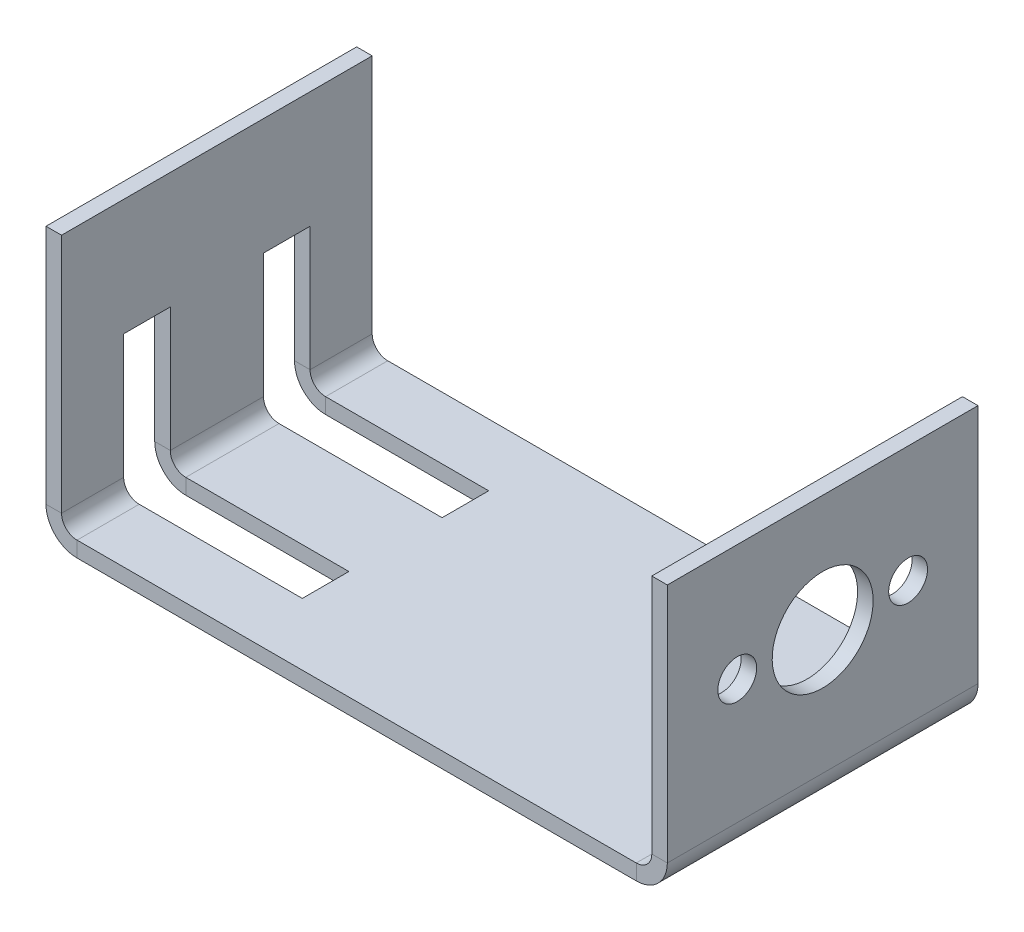
ISO-10303-21;
HEADER;
FILE_DESCRIPTION(('STEP AP214'),'2;1');
FILE_NAME('part.step','',(''),(''),'','','');
FILE_SCHEMA(('AUTOMOTIVE_DESIGN { 1 0 10303 214 1 1 1 1 }'));
ENDSEC;
DATA;
#1=APPLICATION_CONTEXT('core data for automotive mechanical design processes');
#2=APPLICATION_PROTOCOL_DEFINITION('international standard','automotive_design',2000,#1);
#3=PRODUCT_CONTEXT('',#1,'mechanical');
#4=PRODUCT('Part','Part','',(#3));
#5=PRODUCT_RELATED_PRODUCT_CATEGORY('part','',(#4));
#6=PRODUCT_DEFINITION_FORMATION('','',#4);
#7=PRODUCT_DEFINITION_CONTEXT('part definition',#1,'design');
#8=PRODUCT_DEFINITION('design','',#6,#7);
#9=PRODUCT_DEFINITION_SHAPE('','',#8);
#10=(LENGTH_UNIT() NAMED_UNIT(*) SI_UNIT(.MILLI.,.METRE.));
#11=(NAMED_UNIT(*) PLANE_ANGLE_UNIT() SI_UNIT($,.RADIAN.));
#12=(NAMED_UNIT(*) SI_UNIT($,.STERADIAN.) SOLID_ANGLE_UNIT());
#13=UNCERTAINTY_MEASURE_WITH_UNIT(LENGTH_MEASURE(1.E-05),#10,'distance_accuracy_value','');
#14=(GEOMETRIC_REPRESENTATION_CONTEXT(3) GLOBAL_UNCERTAINTY_ASSIGNED_CONTEXT((#13)) GLOBAL_UNIT_ASSIGNED_CONTEXT((#10,
#11,#12)) REPRESENTATION_CONTEXT('',''));
#15=CARTESIAN_POINT('',(0.,0.,0.));
#16=DIRECTION('',(0.,0.,1.));
#17=DIRECTION('',(1.,0.,0.));
#18=AXIS2_PLACEMENT_3D('',#15,#16,#17);
#19=CARTESIAN_POINT('',(-15.,20.0000000000001,12.));
#20=DIRECTION('',(0.,0.,1.));
#21=DIRECTION('',(0.,-1.,0.));
#22=AXIS2_PLACEMENT_3D('',#19,#20,#21);
#23=PLANE('',#22);
#24=DIRECTION('',(0.,-1.,0.));
#25=VECTOR('',#24,1.);
#26=CARTESIAN_POINT('',(-38.,-1.41530656011703E-13,12.));
#27=LINE('',#26,#25);
#28=CARTESIAN_POINT('',(-38.,20.0000000000001,12.));
#29=VERTEX_POINT('',#28);
#30=CARTESIAN_POINT('',(-38.,4.,12.));
#31=VERTEX_POINT('',#30);
#32=EDGE_CURVE('E601',#29,#31,#27,.T.);
#33=ORIENTED_EDGE('',*,*,#32,.T.);
#34=DIRECTION('',(-1.,0.,0.));
#35=VECTOR('',#34,1.);
#36=CARTESIAN_POINT('',(-38.,4.,12.));
#37=LINE('',#36,#35);
#38=CARTESIAN_POINT('',(-40.,3.99999999999999,12.));
#39=VERTEX_POINT('',#38);
#40=EDGE_CURVE('E13',#31,#39,#37,.T.);
#41=ORIENTED_EDGE('',*,*,#40,.T.);
#42=DIRECTION('',(0.,1.,0.));
#43=VECTOR('',#42,1.);
#44=CARTESIAN_POINT('',(-40.,20.,12.));
#45=LINE('',#44,#43);
#46=CARTESIAN_POINT('',(-40.,20.,12.));
#47=VERTEX_POINT('',#46);
#48=EDGE_CURVE('E282',#39,#47,#45,.T.);
#49=ORIENTED_EDGE('',*,*,#48,.T.);
#50=DIRECTION('',(-1.,0.,0.));
#51=VECTOR('',#50,1.);
#52=CARTESIAN_POINT('',(-15.,20.0000000000001,12.));
#53=LINE('',#52,#51);
#54=EDGE_CURVE('E267',#29,#47,#53,.T.);
#55=ORIENTED_EDGE('',*,*,#54,.F.);
#56=EDGE_LOOP('',(#33,#41,#49,#55));
#57=FACE_BOUND('',#56,.T.);
#58=ADVANCED_FACE('F84',(#57),#23,.F.);
#59=DIRECTION('',(1.,0.,0.));
#60=VECTOR('',#59,1.);
#61=CARTESIAN_POINT('',(0.,0.,12.));
#62=LINE('',#61,#60);
#63=CARTESIAN_POINT('',(-36.,0.,12.));
#64=VERTEX_POINT('',#63);
#65=CARTESIAN_POINT('',(-15.,0.,12.));
#66=VERTEX_POINT('',#65);
#67=EDGE_CURVE('E367',#64,#66,#62,.T.);
#68=ORIENTED_EDGE('',*,*,#67,.F.);
#69=DIRECTION('',(0.,1.,0.));
#70=VECTOR('',#69,1.);
#71=CARTESIAN_POINT('',(-36.,0.,12.));
#72=LINE('',#71,#70);
#73=CARTESIAN_POINT('',(-36.,2.,12.));
#74=VERTEX_POINT('',#73);
#75=EDGE_CURVE('E91',#64,#74,#72,.T.);
#76=ORIENTED_EDGE('',*,*,#75,.T.);
#77=DIRECTION('',(1.,0.,0.));
#78=VECTOR('',#77,1.);
#79=CARTESIAN_POINT('',(0.,2.,12.));
#80=LINE('',#79,#78);
#81=CARTESIAN_POINT('',(-15.,2.,12.));
#82=VERTEX_POINT('',#81);
#83=EDGE_CURVE('E361',#74,#82,#80,.T.);
#84=ORIENTED_EDGE('',*,*,#83,.T.);
#85=DIRECTION('',(0.,1.,0.));
#86=VECTOR('',#85,1.);
#87=CARTESIAN_POINT('',(-15.,20.0000000000001,12.));
#88=LINE('',#87,#86);
#89=EDGE_CURVE('E281',#66,#82,#88,.T.);
#90=ORIENTED_EDGE('',*,*,#89,.F.);
#91=EDGE_LOOP('',(#68,#76,#84,#90));
#92=FACE_BOUND('',#91,.T.);
#93=ADVANCED_FACE('F639',(#92),#23,.F.);
#94=CARTESIAN_POINT('',(-15.,20.0000000000001,6.));
#95=DIRECTION('',(0.,0.,-1.));
#96=DIRECTION('',(0.,1.,0.));
#97=AXIS2_PLACEMENT_3D('',#94,#95,#96);
#98=PLANE('',#97);
#99=DIRECTION('',(0.,-1.,0.));
#100=VECTOR('',#99,1.);
#101=CARTESIAN_POINT('',(-40.,20.,6.));
#102=LINE('',#101,#100);
#103=CARTESIAN_POINT('',(-40.,20.,6.));
#104=VERTEX_POINT('',#103);
#105=CARTESIAN_POINT('',(-40.,3.99999999999999,6.));
#106=VERTEX_POINT('',#105);
#107=EDGE_CURVE('E287',#104,#106,#102,.T.);
#108=ORIENTED_EDGE('',*,*,#107,.T.);
#109=DIRECTION('',(1.,0.,0.));
#110=VECTOR('',#109,1.);
#111=CARTESIAN_POINT('',(-40.,3.99999999999999,6.));
#112=LINE('',#111,#110);
#113=CARTESIAN_POINT('',(-38.,4.,6.));
#114=VERTEX_POINT('',#113);
#115=EDGE_CURVE('E632',#106,#114,#112,.T.);
#116=ORIENTED_EDGE('',*,*,#115,.T.);
#117=DIRECTION('',(0.,1.,0.));
#118=VECTOR('',#117,1.);
#119=CARTESIAN_POINT('',(-38.,-1.42438538706224E-13,6.));
#120=LINE('',#119,#118);
#121=CARTESIAN_POINT('',(-38.,20.,6.));
#122=VERTEX_POINT('',#121);
#123=EDGE_CURVE('E608',#114,#122,#120,.T.);
#124=ORIENTED_EDGE('',*,*,#123,.T.);
#125=DIRECTION('',(-1.,0.,0.));
#126=VECTOR('',#125,1.);
#127=CARTESIAN_POINT('',(-15.,20.0000000000001,6.));
#128=LINE('',#127,#126);
#129=EDGE_CURVE('E277',#122,#104,#128,.T.);
#130=ORIENTED_EDGE('',*,*,#129,.T.);
#131=EDGE_LOOP('',(#108,#116,#124,#130));
#132=FACE_BOUND('',#131,.T.);
#133=ADVANCED_FACE('F740',(#132),#98,.F.);
#134=DIRECTION('',(-1.,0.,0.));
#135=VECTOR('',#134,1.);
#136=CARTESIAN_POINT('',(0.,2.,6.));
#137=LINE('',#136,#135);
#138=CARTESIAN_POINT('',(-15.,2.,6.));
#139=VERTEX_POINT('',#138);
#140=CARTESIAN_POINT('',(-36.,2.,6.));
#141=VERTEX_POINT('',#140);
#142=EDGE_CURVE('E376',#139,#141,#137,.T.);
#143=ORIENTED_EDGE('',*,*,#142,.T.);
#144=DIRECTION('',(0.,-1.,0.));
#145=VECTOR('',#144,1.);
#146=CARTESIAN_POINT('',(-36.,2.,6.));
#147=LINE('',#146,#145);
#148=CARTESIAN_POINT('',(-36.,0.,6.));
#149=VERTEX_POINT('',#148);
#150=EDGE_CURVE('E629',#141,#149,#147,.T.);
#151=ORIENTED_EDGE('',*,*,#150,.T.);
#152=DIRECTION('',(-1.,0.,0.));
#153=VECTOR('',#152,1.);
#154=CARTESIAN_POINT('',(0.,0.,6.));
#155=LINE('',#154,#153);
#156=CARTESIAN_POINT('',(-15.,0.,6.));
#157=VERTEX_POINT('',#156);
#158=EDGE_CURVE('E388',#157,#149,#155,.T.);
#159=ORIENTED_EDGE('',*,*,#158,.F.);
#160=DIRECTION('',(0.,-1.,0.));
#161=VECTOR('',#160,1.);
#162=CARTESIAN_POINT('',(-15.,20.0000000000001,6.));
#163=LINE('',#162,#161);
#164=EDGE_CURVE('E294',#139,#157,#163,.T.);
#165=ORIENTED_EDGE('',*,*,#164,.F.);
#166=EDGE_LOOP('',(#143,#151,#159,#165));
#167=FACE_BOUND('',#166,.T.);
#168=ADVANCED_FACE('F746',(#167),#98,.F.);
#169=CARTESIAN_POINT('',(-15.,20.0000000000001,-6.));
#170=DIRECTION('',(0.,0.,1.));
#171=DIRECTION('',(0.,-1.,0.));
#172=AXIS2_PLACEMENT_3D('',#169,#170,#171);
#173=PLANE('',#172);
#174=DIRECTION('',(0.,-1.,0.));
#175=VECTOR('',#174,1.);
#176=CARTESIAN_POINT('',(-38.,-1.43709574478553E-13,-6.));
#177=LINE('',#176,#175);
#178=CARTESIAN_POINT('',(-38.,20.0000000000001,-6.));
#179=VERTEX_POINT('',#178);
#180=CARTESIAN_POINT('',(-38.,4.,-6.));
#181=VERTEX_POINT('',#180);
#182=EDGE_CURVE('E579',#179,#181,#177,.T.);
#183=ORIENTED_EDGE('',*,*,#182,.T.);
#184=DIRECTION('',(-1.,0.,0.));
#185=VECTOR('',#184,1.);
#186=CARTESIAN_POINT('',(-38.,4.,-6.));
#187=LINE('',#186,#185);
#188=CARTESIAN_POINT('',(-40.,3.99999999999999,-6.));
#189=VERTEX_POINT('',#188);
#190=EDGE_CURVE('E97',#181,#189,#187,.T.);
#191=ORIENTED_EDGE('',*,*,#190,.T.);
#192=DIRECTION('',(0.,1.,0.));
#193=VECTOR('',#192,1.);
#194=CARTESIAN_POINT('',(-40.,20.,-6.));
#195=LINE('',#194,#193);
#196=CARTESIAN_POINT('',(-40.,20.,-6.));
#197=VERTEX_POINT('',#196);
#198=EDGE_CURVE('E320',#189,#197,#195,.T.);
#199=ORIENTED_EDGE('',*,*,#198,.T.);
#200=DIRECTION('',(-1.,0.,0.));
#201=VECTOR('',#200,1.);
#202=CARTESIAN_POINT('',(-15.,20.0000000000001,-6.));
#203=LINE('',#202,#201);
#204=EDGE_CURVE('E309',#179,#197,#203,.T.);
#205=ORIENTED_EDGE('',*,*,#204,.F.);
#206=EDGE_LOOP('',(#183,#191,#199,#205));
#207=FACE_BOUND('',#206,.T.);
#208=ADVANCED_FACE('F759',(#207),#173,.F.);
#209=DIRECTION('',(1.,0.,0.));
#210=VECTOR('',#209,1.);
#211=CARTESIAN_POINT('',(0.,0.,-6.));
#212=LINE('',#211,#210);
#213=CARTESIAN_POINT('',(-36.,0.,-6.));
#214=VERTEX_POINT('',#213);
#215=CARTESIAN_POINT('',(-15.,0.,-6.));
#216=VERTEX_POINT('',#215);
#217=EDGE_CURVE('E337',#214,#216,#212,.T.);
#218=ORIENTED_EDGE('',*,*,#217,.F.);
#219=DIRECTION('',(0.,1.,0.));
#220=VECTOR('',#219,1.);
#221=CARTESIAN_POINT('',(-36.,0.,-6.));
#222=LINE('',#221,#220);
#223=CARTESIAN_POINT('',(-36.,2.,-6.));
#224=VERTEX_POINT('',#223);
#225=EDGE_CURVE('E624',#214,#224,#222,.T.);
#226=ORIENTED_EDGE('',*,*,#225,.T.);
#227=DIRECTION('',(1.,0.,0.));
#228=VECTOR('',#227,1.);
#229=CARTESIAN_POINT('',(0.,2.,-6.));
#230=LINE('',#229,#228);
#231=CARTESIAN_POINT('',(-15.,2.00000000000001,-6.));
#232=VERTEX_POINT('',#231);
#233=EDGE_CURVE('E335',#224,#232,#230,.T.);
#234=ORIENTED_EDGE('',*,*,#233,.T.);
#235=DIRECTION('',(0.,1.,0.));
#236=VECTOR('',#235,1.);
#237=CARTESIAN_POINT('',(-15.,20.0000000000001,-6.));
#238=LINE('',#237,#236);
#239=EDGE_CURVE('E308',#216,#232,#238,.T.);
#240=ORIENTED_EDGE('',*,*,#239,.F.);
#241=EDGE_LOOP('',(#218,#226,#234,#240));
#242=FACE_BOUND('',#241,.T.);
#243=ADVANCED_FACE('F762',(#242),#173,.F.);
#244=CARTESIAN_POINT('',(-15.,20.0000000000001,-12.));
#245=DIRECTION('',(0.,0.,-1.));
#246=DIRECTION('',(0.,1.,0.));
#247=AXIS2_PLACEMENT_3D('',#244,#245,#246);
#248=PLANE('',#247);
#249=DIRECTION('',(0.,-1.,0.));
#250=VECTOR('',#249,1.);
#251=CARTESIAN_POINT('',(-40.,20.,-12.));
#252=LINE('',#251,#250);
#253=CARTESIAN_POINT('',(-40.,20.,-12.));
#254=VERTEX_POINT('',#253);
#255=CARTESIAN_POINT('',(-40.,4.,-12.));
#256=VERTEX_POINT('',#255);
#257=EDGE_CURVE('E322',#254,#256,#252,.T.);
#258=ORIENTED_EDGE('',*,*,#257,.T.);
#259=DIRECTION('',(1.,0.,0.));
#260=VECTOR('',#259,1.);
#261=CARTESIAN_POINT('',(-40.,4.,-12.));
#262=LINE('',#261,#260);
#263=CARTESIAN_POINT('',(-38.,4.,-12.));
#264=VERTEX_POINT('',#263);
#265=EDGE_CURVE('E622',#256,#264,#262,.T.);
#266=ORIENTED_EDGE('',*,*,#265,.T.);
#267=DIRECTION('',(0.,1.,0.));
#268=VECTOR('',#267,1.);
#269=CARTESIAN_POINT('',(-38.,-1.4443588063417E-13,-12.));
#270=LINE('',#269,#268);
#271=CARTESIAN_POINT('',(-38.,20.,-12.));
#272=VERTEX_POINT('',#271);
#273=EDGE_CURVE('E602',#264,#272,#270,.T.);
#274=ORIENTED_EDGE('',*,*,#273,.T.);
#275=DIRECTION('',(-1.,0.,0.));
#276=VECTOR('',#275,1.);
#277=CARTESIAN_POINT('',(-15.,20.0000000000001,-12.));
#278=LINE('',#277,#276);
#279=EDGE_CURVE('E307',#272,#254,#278,.T.);
#280=ORIENTED_EDGE('',*,*,#279,.T.);
#281=EDGE_LOOP('',(#258,#266,#274,#280));
#282=FACE_BOUND('',#281,.T.);
#283=ADVANCED_FACE('F1100',(#282),#248,.F.);
#284=DIRECTION('',(-1.,0.,0.));
#285=VECTOR('',#284,1.);
#286=CARTESIAN_POINT('',(0.,2.,-12.));
#287=LINE('',#286,#285);
#288=CARTESIAN_POINT('',(-15.,2.00000000000001,-12.));
#289=VERTEX_POINT('',#288);
#290=CARTESIAN_POINT('',(-36.,2.,-12.));
#291=VERTEX_POINT('',#290);
#292=EDGE_CURVE('E348',#289,#291,#287,.T.);
#293=ORIENTED_EDGE('',*,*,#292,.T.);
#294=DIRECTION('',(0.,-1.,0.));
#295=VECTOR('',#294,1.);
#296=CARTESIAN_POINT('',(-36.,2.,-12.));
#297=LINE('',#296,#295);
#298=CARTESIAN_POINT('',(-36.,0.,-12.));
#299=VERTEX_POINT('',#298);
#300=EDGE_CURVE('E616',#291,#299,#297,.T.);
#301=ORIENTED_EDGE('',*,*,#300,.T.);
#302=DIRECTION('',(-1.,0.,0.));
#303=VECTOR('',#302,1.);
#304=CARTESIAN_POINT('',(0.,0.,-12.));
#305=LINE('',#304,#303);
#306=CARTESIAN_POINT('',(-15.,0.,-12.));
#307=VERTEX_POINT('',#306);
#308=EDGE_CURVE('E357',#307,#299,#305,.T.);
#309=ORIENTED_EDGE('',*,*,#308,.F.);
#310=DIRECTION('',(0.,-1.,0.));
#311=VECTOR('',#310,1.);
#312=CARTESIAN_POINT('',(-15.,20.0000000000001,-12.));
#313=LINE('',#312,#311);
#314=EDGE_CURVE('E316',#289,#307,#313,.T.);
#315=ORIENTED_EDGE('',*,*,#314,.F.);
#316=EDGE_LOOP('',(#293,#301,#309,#315));
#317=FACE_BOUND('',#316,.T.);
#318=ADVANCED_FACE('F789',(#317),#248,.F.);
#319=CARTESIAN_POINT('',(-36.,4.,20.));
#320=DIRECTION('',(0.,0.,1.));
#321=DIRECTION('',(-1.,0.,0.));
#322=AXIS2_PLACEMENT_3D('',#319,#320,#321);
#323=CYLINDRICAL_SURFACE('',#322,4.);
#324=CARTESIAN_POINT('',(-36.,4.,6.));
#325=DIRECTION('',(0.,0.,-1.));
#326=DIRECTION('',(0.,1.,0.));
#327=AXIS2_PLACEMENT_3D('',#324,#325,#326);
#328=CIRCLE('',#327,4.);
#329=EDGE_CURVE('E385',#106,#149,#328,.F.);
#330=ORIENTED_EDGE('',*,*,#329,.F.);
#331=DIRECTION('',(0.,0.,1.));
#332=VECTOR('',#331,1.);
#333=CARTESIAN_POINT('',(-40.,3.99999999999999,-20.));
#334=LINE('',#333,#332);
#335=EDGE_CURVE('E444',#106,#189,#334,.F.);
#336=ORIENTED_EDGE('',*,*,#335,.T.);
#337=CARTESIAN_POINT('',(-36.,4.,-6.));
#338=DIRECTION('',(0.,0.,1.));
#339=DIRECTION('',(0.,-1.,0.));
#340=AXIS2_PLACEMENT_3D('',#337,#338,#339);
#341=CIRCLE('',#340,4.);
#342=EDGE_CURVE('E340',#214,#189,#341,.F.);
#343=ORIENTED_EDGE('',*,*,#342,.F.);
#344=DIRECTION('',(0.,0.,1.));
#345=VECTOR('',#344,1.);
#346=CARTESIAN_POINT('',(-36.,0.,20.));
#347=LINE('',#346,#345);
#348=EDGE_CURVE('E466',#149,#214,#347,.F.);
#349=ORIENTED_EDGE('',*,*,#348,.F.);
#350=EDGE_LOOP('',(#330,#336,#343,#349));
#351=FACE_BOUND('',#350,.T.);
#352=ADVANCED_FACE('F802',(#351),#323,.T.);
#353=CARTESIAN_POINT('',(-36.,4.,-12.));
#354=DIRECTION('',(0.,0.,-1.));
#355=DIRECTION('',(0.,1.,0.));
#356=AXIS2_PLACEMENT_3D('',#353,#354,#355);
#357=CIRCLE('',#356,4.);
#358=EDGE_CURVE('E355',#256,#299,#357,.F.);
#359=ORIENTED_EDGE('',*,*,#358,.F.);
#360=CARTESIAN_POINT('',(-40.,3.99999999999999,-20.));
#361=VERTEX_POINT('',#360);
#362=EDGE_CURVE('E441',#256,#361,#334,.F.);
#363=ORIENTED_EDGE('',*,*,#362,.T.);
#364=CARTESIAN_POINT('',(-36.,4.,-20.));
#365=DIRECTION('',(0.,0.,1.));
#366=DIRECTION('',(1.,0.,0.));
#367=AXIS2_PLACEMENT_3D('',#364,#365,#366);
#368=CIRCLE('',#367,4.);
#369=CARTESIAN_POINT('',(-36.,0.,-20.));
#370=VERTEX_POINT('',#369);
#371=EDGE_CURVE('E464',#370,#361,#368,.F.);
#372=ORIENTED_EDGE('',*,*,#371,.F.);
#373=EDGE_CURVE('E470',#299,#370,#347,.F.);
#374=ORIENTED_EDGE('',*,*,#373,.F.);
#375=EDGE_LOOP('',(#359,#363,#372,#374));
#376=FACE_BOUND('',#375,.T.);
#377=ADVANCED_FACE('F878',(#376),#323,.T.);
#378=CARTESIAN_POINT('',(-36.,4.,20.));
#379=DIRECTION('',(0.,0.,1.));
#380=DIRECTION('',(-1.,0.,0.));
#381=AXIS2_PLACEMENT_3D('',#378,#379,#380);
#382=CYLINDRICAL_SURFACE('',#381,2.);
#383=DIRECTION('',(0.,0.,1.));
#384=VECTOR('',#383,1.);
#385=CARTESIAN_POINT('',(-38.,4.,-20.));
#386=LINE('',#385,#384);
#387=EDGE_CURVE('E455',#181,#114,#386,.T.);
#388=ORIENTED_EDGE('',*,*,#387,.T.);
#389=CARTESIAN_POINT('',(-36.,4.,6.));
#390=DIRECTION('',(0.,0.,-1.));
#391=DIRECTION('',(0.,1.,0.));
#392=AXIS2_PLACEMENT_3D('',#389,#390,#391);
#393=CIRCLE('',#392,2.);
#394=EDGE_CURVE('E371',#114,#141,#393,.F.);
#395=ORIENTED_EDGE('',*,*,#394,.T.);
#396=DIRECTION('',(0.,0.,1.));
#397=VECTOR('',#396,1.);
#398=CARTESIAN_POINT('',(-36.,2.,20.));
#399=LINE('',#398,#397);
#400=EDGE_CURVE('E481',#141,#224,#399,.F.);
#401=ORIENTED_EDGE('',*,*,#400,.T.);
#402=CARTESIAN_POINT('',(-36.,4.,-6.));
#403=DIRECTION('',(0.,0.,1.));
#404=DIRECTION('',(0.,-1.,0.));
#405=AXIS2_PLACEMENT_3D('',#402,#403,#404);
#406=CIRCLE('',#405,2.);
#407=EDGE_CURVE('E301',#224,#181,#406,.F.);
#408=ORIENTED_EDGE('',*,*,#407,.T.);
#409=EDGE_LOOP('',(#388,#395,#401,#408));
#410=FACE_BOUND('',#409,.T.);
#411=ADVANCED_FACE('F772',(#410),#382,.F.);
#412=CARTESIAN_POINT('',(-38.,4.,-20.));
#413=VERTEX_POINT('',#412);
#414=EDGE_CURVE('E447',#413,#264,#386,.T.);
#415=ORIENTED_EDGE('',*,*,#414,.T.);
#416=CARTESIAN_POINT('',(-36.,4.,-12.));
#417=DIRECTION('',(0.,0.,-1.));
#418=DIRECTION('',(0.,1.,0.));
#419=AXIS2_PLACEMENT_3D('',#416,#417,#418);
#420=CIRCLE('',#419,2.);
#421=EDGE_CURVE('E342',#264,#291,#420,.F.);
#422=ORIENTED_EDGE('',*,*,#421,.T.);
#423=CARTESIAN_POINT('',(-36.,2.,-20.));
#424=VERTEX_POINT('',#423);
#425=EDGE_CURVE('E483',#291,#424,#399,.F.);
#426=ORIENTED_EDGE('',*,*,#425,.T.);
#427=CARTESIAN_POINT('',(-36.,4.,-20.));
#428=DIRECTION('',(0.,0.,1.));
#429=DIRECTION('',(1.,0.,0.));
#430=AXIS2_PLACEMENT_3D('',#427,#428,#429);
#431=CIRCLE('',#430,2.);
#432=EDGE_CURVE('E477',#424,#413,#431,.F.);
#433=ORIENTED_EDGE('',*,*,#432,.T.);
#434=EDGE_LOOP('',(#415,#422,#426,#433));
#435=FACE_BOUND('',#434,.T.);
#436=ADVANCED_FACE('F782',(#435),#382,.F.);
#437=CARTESIAN_POINT('',(40.,2.,20.));
#438=DIRECTION('',(0.,0.,-1.));
#439=DIRECTION('',(-1.,0.,0.));
#440=AXIS2_PLACEMENT_3D('',#437,#438,#439);
#441=PLANE('',#440);
#442=DIRECTION('',(0.,-1.,0.));
#443=VECTOR('',#442,1.);
#444=CARTESIAN_POINT('',(-36.,2.,20.));
#445=LINE('',#444,#443);
#446=CARTESIAN_POINT('',(-36.,2.,20.));
#447=VERTEX_POINT('',#446);
#448=CARTESIAN_POINT('',(-36.,0.,20.));
#449=VERTEX_POINT('',#448);
#450=EDGE_CURVE('E471',#447,#449,#445,.T.);
#451=ORIENTED_EDGE('',*,*,#450,.T.);
#452=DIRECTION('',(1.,0.,0.));
#453=VECTOR('',#452,1.);
#454=CARTESIAN_POINT('',(40.,0.,20.));
#455=LINE('',#454,#453);
#456=CARTESIAN_POINT('',(36.,0.,20.));
#457=VERTEX_POINT('',#456);
#458=EDGE_CURVE('E566',#449,#457,#455,.T.);
#459=ORIENTED_EDGE('',*,*,#458,.T.);
#460=DIRECTION('',(0.,-1.,0.));
#461=VECTOR('',#460,1.);
#462=CARTESIAN_POINT('',(36.,2.,20.));
#463=LINE('',#462,#461);
#464=CARTESIAN_POINT('',(36.,2.,20.));
#465=VERTEX_POINT('',#464);
#466=EDGE_CURVE('E564',#465,#457,#463,.T.);
#467=ORIENTED_EDGE('',*,*,#466,.F.);
#468=DIRECTION('',(1.,0.,0.));
#469=VECTOR('',#468,1.);
#470=CARTESIAN_POINT('',(40.,2.,20.));
#471=LINE('',#470,#469);
#472=EDGE_CURVE('E573',#447,#465,#471,.T.);
#473=ORIENTED_EDGE('',*,*,#472,.F.);
#474=EDGE_LOOP('',(#451,#459,#467,#473));
#475=FACE_BOUND('',#474,.T.);
#476=ADVANCED_FACE('F88',(#475),#441,.F.);
#477=CARTESIAN_POINT('',(40.,2.,-20.));
#478=DIRECTION('',(0.,0.,1.));
#479=DIRECTION('',(1.,0.,0.));
#480=AXIS2_PLACEMENT_3D('',#477,#478,#479);
#481=PLANE('',#480);
#482=DIRECTION('',(0.,-1.,0.));
#483=VECTOR('',#482,1.);
#484=CARTESIAN_POINT('',(-36.,2.,-20.));
#485=LINE('',#484,#483);
#486=EDGE_CURVE('E488',#424,#370,#485,.T.);
#487=ORIENTED_EDGE('',*,*,#486,.F.);
#488=DIRECTION('',(-1.,0.,0.));
#489=VECTOR('',#488,1.);
#490=CARTESIAN_POINT('',(40.,2.,-20.));
#491=LINE('',#490,#489);
#492=CARTESIAN_POINT('',(36.,2.,-20.));
#493=VERTEX_POINT('',#492);
#494=EDGE_CURVE('E575',#493,#424,#491,.T.);
#495=ORIENTED_EDGE('',*,*,#494,.F.);
#496=DIRECTION('',(0.,-1.,0.));
#497=VECTOR('',#496,1.);
#498=CARTESIAN_POINT('',(36.,2.,-20.));
#499=LINE('',#498,#497);
#500=CARTESIAN_POINT('',(36.,0.,-20.));
#501=VERTEX_POINT('',#500);
#502=EDGE_CURVE('E548',#493,#501,#499,.T.);
#503=ORIENTED_EDGE('',*,*,#502,.T.);
#504=DIRECTION('',(-1.,0.,0.));
#505=VECTOR('',#504,1.);
#506=CARTESIAN_POINT('',(40.,0.,-20.));
#507=LINE('',#506,#505);
#508=EDGE_CURVE('E574',#501,#370,#507,.T.);
#509=ORIENTED_EDGE('',*,*,#508,.T.);
#510=EDGE_LOOP('',(#487,#495,#503,#509));
#511=FACE_BOUND('',#510,.T.);
#512=ADVANCED_FACE('F692',(#511),#481,.F.);
#513=CARTESIAN_POINT('',(0.,2.,0.));
#514=DIRECTION('',(0.,1.,0.));
#515=DIRECTION('',(0.,0.,1.));
#516=AXIS2_PLACEMENT_3D('',#513,#514,#515);
#517=PLANE('',#516);
#518=ORIENTED_EDGE('',*,*,#142,.F.);
#519=DIRECTION('',(0.,0.,1.));
#520=VECTOR('',#519,1.);
#521=CARTESIAN_POINT('',(-15.,2.,0.));
#522=LINE('',#521,#520);
#523=EDGE_CURVE('E395',#139,#82,#522,.T.);
#524=ORIENTED_EDGE('',*,*,#523,.T.);
#525=ORIENTED_EDGE('',*,*,#83,.F.);
#526=EDGE_CURVE('E478',#447,#74,#399,.F.);
#527=ORIENTED_EDGE('',*,*,#526,.F.);
#528=ORIENTED_EDGE('',*,*,#472,.T.);
#529=DIRECTION('',(0.,0.,-1.));
#530=VECTOR('',#529,1.);
#531=CARTESIAN_POINT('',(36.,2.,-20.));
#532=LINE('',#531,#530);
#533=EDGE_CURVE('E560',#493,#465,#532,.F.);
#534=ORIENTED_EDGE('',*,*,#533,.F.);
#535=ORIENTED_EDGE('',*,*,#494,.T.);
#536=ORIENTED_EDGE('',*,*,#425,.F.);
#537=ORIENTED_EDGE('',*,*,#292,.F.);
#538=DIRECTION('',(0.,0.,1.));
#539=VECTOR('',#538,1.);
#540=CARTESIAN_POINT('',(-15.,2.,0.));
#541=LINE('',#540,#539);
#542=EDGE_CURVE('E387',#289,#232,#541,.T.);
#543=ORIENTED_EDGE('',*,*,#542,.T.);
#544=ORIENTED_EDGE('',*,*,#233,.F.);
#545=ORIENTED_EDGE('',*,*,#400,.F.);
#546=EDGE_LOOP('',(#518,#524,#525,#527,#528,#534,#535,#536,#537,#543,#544,#545));
#547=FACE_BOUND('',#546,.T.);
#548=ADVANCED_FACE('F649',(#547),#517,.T.);
#549=CARTESIAN_POINT('',(0.,0.,0.));
#550=DIRECTION('',(0.,1.,0.));
#551=DIRECTION('',(0.,0.,1.));
#552=AXIS2_PLACEMENT_3D('',#549,#550,#551);
#553=PLANE('',#552);
#554=DIRECTION('',(0.,0.,1.));
#555=VECTOR('',#554,1.);
#556=CARTESIAN_POINT('',(-15.,0.,0.));
#557=LINE('',#556,#555);
#558=EDGE_CURVE('E613',#157,#66,#557,.T.);
#559=ORIENTED_EDGE('',*,*,#558,.F.);
#560=ORIENTED_EDGE('',*,*,#158,.T.);
#561=ORIENTED_EDGE('',*,*,#348,.T.);
#562=ORIENTED_EDGE('',*,*,#217,.T.);
#563=DIRECTION('',(0.,0.,1.));
#564=VECTOR('',#563,1.);
#565=CARTESIAN_POINT('',(-15.,0.,0.));
#566=LINE('',#565,#564);
#567=EDGE_CURVE('E615',#307,#216,#566,.T.);
#568=ORIENTED_EDGE('',*,*,#567,.F.);
#569=ORIENTED_EDGE('',*,*,#308,.T.);
#570=ORIENTED_EDGE('',*,*,#373,.T.);
#571=ORIENTED_EDGE('',*,*,#508,.F.);
#572=DIRECTION('',(0.,0.,-1.));
#573=VECTOR('',#572,1.);
#574=CARTESIAN_POINT('',(36.,0.,-20.));
#575=LINE('',#574,#573);
#576=EDGE_CURVE('E538',#501,#457,#575,.F.);
#577=ORIENTED_EDGE('',*,*,#576,.T.);
#578=ORIENTED_EDGE('',*,*,#458,.F.);
#579=EDGE_CURVE('E461',#449,#64,#347,.F.);
#580=ORIENTED_EDGE('',*,*,#579,.T.);
#581=ORIENTED_EDGE('',*,*,#67,.T.);
#582=EDGE_LOOP('',(#559,#560,#561,#562,#568,#569,#570,#571,#577,#578,#580,#581));
#583=FACE_BOUND('',#582,.T.);
#584=ADVANCED_FACE('F679',(#583),#553,.F.);
#585=CARTESIAN_POINT('',(36.,4.,20.));
#586=DIRECTION('',(0.,0.,1.));
#587=DIRECTION('',(1.,0.,0.));
#588=AXIS2_PLACEMENT_3D('',#585,#586,#587);
#589=PLANE('',#588);
#590=DIRECTION('',(1.,0.,0.));
#591=VECTOR('',#590,1.);
#592=CARTESIAN_POINT('',(40.,3.99999999999999,20.));
#593=LINE('',#592,#591);
#594=CARTESIAN_POINT('',(38.,4.,20.));
#595=VERTEX_POINT('',#594);
#596=CARTESIAN_POINT('',(40.,3.99999999999999,20.));
#597=VERTEX_POINT('',#596);
#598=EDGE_CURVE('E494',#595,#597,#593,.T.);
#599=ORIENTED_EDGE('',*,*,#598,.F.);
#600=CARTESIAN_POINT('',(36.,4.,20.));
#601=DIRECTION('',(0.,0.,-1.));
#602=DIRECTION('',(-1.,0.,0.));
#603=AXIS2_PLACEMENT_3D('',#600,#601,#602);
#604=CIRCLE('',#603,2.);
#605=EDGE_CURVE('E554',#465,#595,#604,.F.);
#606=ORIENTED_EDGE('',*,*,#605,.F.);
#607=ORIENTED_EDGE('',*,*,#466,.T.);
#608=CARTESIAN_POINT('',(36.,4.,20.));
#609=DIRECTION('',(0.,0.,-1.));
#610=DIRECTION('',(-1.,0.,0.));
#611=AXIS2_PLACEMENT_3D('',#608,#609,#610);
#612=CIRCLE('',#611,4.);
#613=EDGE_CURVE('E541',#457,#597,#612,.F.);
#614=ORIENTED_EDGE('',*,*,#613,.T.);
#615=EDGE_LOOP('',(#599,#606,#607,#614));
#616=FACE_BOUND('',#615,.T.);
#617=ADVANCED_FACE('F718',(#616),#589,.T.);
#618=CARTESIAN_POINT('',(36.,4.,-20.));
#619=DIRECTION('',(0.,0.,1.));
#620=DIRECTION('',(1.,0.,0.));
#621=AXIS2_PLACEMENT_3D('',#618,#619,#620);
#622=PLANE('',#621);
#623=CARTESIAN_POINT('',(36.,4.,-20.));
#624=DIRECTION('',(0.,0.,-1.));
#625=DIRECTION('',(-1.,0.,0.));
#626=AXIS2_PLACEMENT_3D('',#623,#624,#625);
#627=CIRCLE('',#626,2.);
#628=CARTESIAN_POINT('',(38.,4.,-20.));
#629=VERTEX_POINT('',#628);
#630=EDGE_CURVE('E499',#629,#493,#627,.T.);
#631=ORIENTED_EDGE('',*,*,#630,.F.);
#632=DIRECTION('',(1.,0.,0.));
#633=VECTOR('',#632,1.);
#634=CARTESIAN_POINT('',(38.,4.,-20.));
#635=LINE('',#634,#633);
#636=CARTESIAN_POINT('',(40.,3.99999999999999,-20.));
#637=VERTEX_POINT('',#636);
#638=EDGE_CURVE('E529',#629,#637,#635,.T.);
#639=ORIENTED_EDGE('',*,*,#638,.T.);
#640=CARTESIAN_POINT('',(36.,4.,-20.));
#641=DIRECTION('',(0.,0.,-1.));
#642=DIRECTION('',(-1.,0.,0.));
#643=AXIS2_PLACEMENT_3D('',#640,#641,#642);
#644=CIRCLE('',#643,4.);
#645=EDGE_CURVE('E543',#637,#501,#644,.T.);
#646=ORIENTED_EDGE('',*,*,#645,.T.);
#647=ORIENTED_EDGE('',*,*,#502,.F.);
#648=EDGE_LOOP('',(#631,#639,#646,#647));
#649=FACE_BOUND('',#648,.T.);
#650=ADVANCED_FACE('F694',(#649),#622,.F.);
#651=CARTESIAN_POINT('',(36.,4.,-20.));
#652=DIRECTION('',(0.,0.,-1.));
#653=DIRECTION('',(1.,0.,0.));
#654=AXIS2_PLACEMENT_3D('',#651,#652,#653);
#655=CYLINDRICAL_SURFACE('',#654,4.);
#656=ORIENTED_EDGE('',*,*,#576,.F.);
#657=ORIENTED_EDGE('',*,*,#645,.F.);
#658=DIRECTION('',(0.,0.,-1.));
#659=VECTOR('',#658,1.);
#660=CARTESIAN_POINT('',(40.,3.99999999999999,0.));
#661=LINE('',#660,#659);
#662=EDGE_CURVE('E526',#597,#637,#661,.T.);
#663=ORIENTED_EDGE('',*,*,#662,.F.);
#664=ORIENTED_EDGE('',*,*,#613,.F.);
#665=EDGE_LOOP('',(#656,#657,#663,#664));
#666=FACE_BOUND('',#665,.T.);
#667=ADVANCED_FACE('F719',(#666),#655,.T.);
#668=CARTESIAN_POINT('',(36.,4.,-20.));
#669=DIRECTION('',(0.,0.,-1.));
#670=DIRECTION('',(1.,0.,0.));
#671=AXIS2_PLACEMENT_3D('',#668,#669,#670);
#672=CYLINDRICAL_SURFACE('',#671,2.);
#673=ORIENTED_EDGE('',*,*,#533,.T.);
#674=ORIENTED_EDGE('',*,*,#605,.T.);
#675=DIRECTION('',(0.,0.,1.));
#676=VECTOR('',#675,1.);
#677=CARTESIAN_POINT('',(38.,4.,20.));
#678=LINE('',#677,#676);
#679=EDGE_CURVE('E533',#595,#629,#678,.F.);
#680=ORIENTED_EDGE('',*,*,#679,.T.);
#681=ORIENTED_EDGE('',*,*,#630,.T.);
#682=EDGE_LOOP('',(#673,#674,#680,#681));
#683=FACE_BOUND('',#682,.T.);
#684=ADVANCED_FACE('F698',(#683),#672,.F.);
#685=CARTESIAN_POINT('',(40.,1.99999999999999,-20.));
#686=DIRECTION('',(0.,0.,-1.));
#687=DIRECTION('',(-1.,0.,0.));
#688=AXIS2_PLACEMENT_3D('',#685,#686,#687);
#689=PLANE('',#688);
#690=DIRECTION('',(0.,-1.,0.));
#691=VECTOR('',#690,1.);
#692=CARTESIAN_POINT('',(40.,1.99999999999999,-20.));
#693=LINE('',#692,#691);
#694=CARTESIAN_POINT('',(40.0000000000001,35.,-20.));
#695=VERTEX_POINT('',#694);
#696=EDGE_CURVE('E504',#695,#637,#693,.T.);
#697=ORIENTED_EDGE('',*,*,#696,.T.);
#698=ORIENTED_EDGE('',*,*,#638,.F.);
#699=DIRECTION('',(0.,1.,0.));
#700=VECTOR('',#699,1.);
#701=CARTESIAN_POINT('',(38.,-1.42983268322937E-13,-20.));
#702=LINE('',#701,#700);
#703=CARTESIAN_POINT('',(38.0000000000001,35.,-20.));
#704=VERTEX_POINT('',#703);
#705=EDGE_CURVE('E514',#704,#629,#702,.F.);
#706=ORIENTED_EDGE('',*,*,#705,.F.);
#707=DIRECTION('',(-1.,0.,0.));
#708=VECTOR('',#707,1.);
#709=CARTESIAN_POINT('',(40.0000000000001,35.,-20.));
#710=LINE('',#709,#708);
#711=EDGE_CURVE('E497',#695,#704,#710,.T.);
#712=ORIENTED_EDGE('',*,*,#711,.F.);
#713=EDGE_LOOP('',(#697,#698,#706,#712));
#714=FACE_BOUND('',#713,.T.);
#715=ADVANCED_FACE('F715',(#714),#689,.T.);
#716=CARTESIAN_POINT('',(40.0000000000001,35.,20.));
#717=DIRECTION('',(0.,0.,1.));
#718=DIRECTION('',(1.,0.,0.));
#719=AXIS2_PLACEMENT_3D('',#716,#717,#718);
#720=PLANE('',#719);
#721=DIRECTION('',(0.,-1.,0.));
#722=VECTOR('',#721,1.);
#723=CARTESIAN_POINT('',(38.,-1.42983268322937E-13,20.));
#724=LINE('',#723,#722);
#725=CARTESIAN_POINT('',(38.0000000000001,35.,20.));
#726=VERTEX_POINT('',#725);
#727=EDGE_CURVE('E523',#595,#726,#724,.F.);
#728=ORIENTED_EDGE('',*,*,#727,.F.);
#729=ORIENTED_EDGE('',*,*,#598,.T.);
#730=DIRECTION('',(0.,1.,0.));
#731=VECTOR('',#730,1.);
#732=CARTESIAN_POINT('',(40.0000000000001,35.,20.));
#733=LINE('',#732,#731);
#734=CARTESIAN_POINT('',(40.0000000000001,35.,20.));
#735=VERTEX_POINT('',#734);
#736=EDGE_CURVE('E512',#597,#735,#733,.T.);
#737=ORIENTED_EDGE('',*,*,#736,.T.);
#738=DIRECTION('',(-1.,0.,0.));
#739=VECTOR('',#738,1.);
#740=CARTESIAN_POINT('',(40.0000000000001,35.,20.));
#741=LINE('',#740,#739);
#742=EDGE_CURVE('E498',#735,#726,#741,.T.);
#743=ORIENTED_EDGE('',*,*,#742,.T.);
#744=EDGE_LOOP('',(#728,#729,#737,#743));
#745=FACE_BOUND('',#744,.T.);
#746=ADVANCED_FACE('F702',(#745),#720,.T.);
#747=CARTESIAN_POINT('',(40.,-1.49966231000623E-13,0.));
#748=DIRECTION('',(1.,0.,0.));
#749=DIRECTION('',(0.,1.,0.));
#750=AXIS2_PLACEMENT_3D('',#747,#748,#749);
#751=PLANE('',#750);
#752=CARTESIAN_POINT('',(40.0000000000001,19.9999999999999,-11.));
#753=DIRECTION('',(1.,0.,0.));
#754=DIRECTION('',(0.,1.,0.));
#755=AXIS2_PLACEMENT_3D('',#752,#753,#754);
#756=CIRCLE('',#755,2.5);
#757=CARTESIAN_POINT('',(40.0000000000001,22.4999999999999,-11.));
#758=VERTEX_POINT('',#757);
#759=EDGE_CURVE('E396',#758,#758,#756,.T.);
#760=ORIENTED_EDGE('',*,*,#759,.F.);
#761=EDGE_LOOP('',(#760));
#762=FACE_BOUND('',#761,.T.);
#763=CARTESIAN_POINT('',(40.0000000000001,19.9999999999999,11.));
#764=DIRECTION('',(1.,0.,0.));
#765=DIRECTION('',(0.,1.,0.));
#766=AXIS2_PLACEMENT_3D('',#763,#764,#765);
#767=CIRCLE('',#766,2.5);
#768=CARTESIAN_POINT('',(40.0000000000001,22.4999999999999,11.));
#769=VERTEX_POINT('',#768);
#770=EDGE_CURVE('E399',#769,#769,#767,.T.);
#771=ORIENTED_EDGE('',*,*,#770,.F.);
#772=EDGE_LOOP('',(#771));
#773=FACE_BOUND('',#772,.T.);
#774=CARTESIAN_POINT('',(40.0000000000001,19.9999999999999,0.));
#775=DIRECTION('',(1.,0.,0.));
#776=DIRECTION('',(0.,1.,0.));
#777=AXIS2_PLACEMENT_3D('',#774,#775,#776);
#778=CIRCLE('',#777,6.5);
#779=CARTESIAN_POINT('',(40.0000000000001,26.4999999999999,0.));
#780=VERTEX_POINT('',#779);
#781=EDGE_CURVE('E403',#780,#780,#778,.T.);
#782=ORIENTED_EDGE('',*,*,#781,.F.);
#783=EDGE_LOOP('',(#782));
#784=FACE_BOUND('',#783,.T.);
#785=ORIENTED_EDGE('',*,*,#736,.F.);
#786=ORIENTED_EDGE('',*,*,#662,.T.);
#787=ORIENTED_EDGE('',*,*,#696,.F.);
#788=DIRECTION('',(0.,0.,-1.));
#789=VECTOR('',#788,1.);
#790=CARTESIAN_POINT('',(40.0000000000001,35.,-20.));
#791=LINE('',#790,#789);
#792=EDGE_CURVE('E506',#735,#695,#791,.T.);
#793=ORIENTED_EDGE('',*,*,#792,.F.);
#794=EDGE_LOOP('',(#785,#786,#787,#793));
#795=FACE_BOUND('',#794,.T.);
#796=ADVANCED_FACE('F714',(#762,#773,#784,#795),#751,.T.);
#797=CARTESIAN_POINT('',(38.,-1.42983268322937E-13,0.));
#798=DIRECTION('',(1.,0.,0.));
#799=DIRECTION('',(0.,1.,0.));
#800=AXIS2_PLACEMENT_3D('',#797,#798,#799);
#801=PLANE('',#800);
#802=CARTESIAN_POINT('',(38.0000000000001,19.9999999999999,-11.));
#803=DIRECTION('',(1.,0.,0.));
#804=DIRECTION('',(0.,1.,0.));
#805=AXIS2_PLACEMENT_3D('',#802,#803,#804);
#806=CIRCLE('',#805,2.5);
#807=CARTESIAN_POINT('',(38.0000000000001,22.4999999999999,-11.));
#808=VERTEX_POINT('',#807);
#809=EDGE_CURVE('E457',#808,#808,#806,.T.);
#810=ORIENTED_EDGE('',*,*,#809,.T.);
#811=EDGE_LOOP('',(#810));
#812=FACE_BOUND('',#811,.T.);
#813=CARTESIAN_POINT('',(38.0000000000001,19.9999999999999,11.));
#814=DIRECTION('',(1.,0.,0.));
#815=DIRECTION('',(0.,1.,0.));
#816=AXIS2_PLACEMENT_3D('',#813,#814,#815);
#817=CIRCLE('',#816,2.5);
#818=CARTESIAN_POINT('',(38.0000000000001,22.4999999999999,11.));
#819=VERTEX_POINT('',#818);
#820=EDGE_CURVE('E588',#819,#819,#817,.T.);
#821=ORIENTED_EDGE('',*,*,#820,.T.);
#822=EDGE_LOOP('',(#821));
#823=FACE_BOUND('',#822,.T.);
#824=CARTESIAN_POINT('',(38.0000000000001,19.9999999999999,0.));
#825=DIRECTION('',(1.,0.,0.));
#826=DIRECTION('',(0.,1.,0.));
#827=AXIS2_PLACEMENT_3D('',#824,#825,#826);
#828=CIRCLE('',#827,6.5);
#829=CARTESIAN_POINT('',(38.0000000000001,26.4999999999999,0.));
#830=VERTEX_POINT('',#829);
#831=EDGE_CURVE('E409',#830,#830,#828,.T.);
#832=ORIENTED_EDGE('',*,*,#831,.T.);
#833=EDGE_LOOP('',(#832));
#834=FACE_BOUND('',#833,.T.);
#835=ORIENTED_EDGE('',*,*,#679,.F.);
#836=ORIENTED_EDGE('',*,*,#727,.T.);
#837=DIRECTION('',(0.,0.,1.));
#838=VECTOR('',#837,1.);
#839=CARTESIAN_POINT('',(38.0000000000001,35.,0.));
#840=LINE('',#839,#838);
#841=EDGE_CURVE('E519',#726,#704,#840,.F.);
#842=ORIENTED_EDGE('',*,*,#841,.T.);
#843=ORIENTED_EDGE('',*,*,#705,.T.);
#844=EDGE_LOOP('',(#835,#836,#842,#843));
#845=FACE_BOUND('',#844,.T.);
#846=ADVANCED_FACE('F697',(#812,#823,#834,#845),#801,.F.);
#847=CARTESIAN_POINT('',(40.0000000000001,35.,-20.));
#848=DIRECTION('',(0.,1.,0.));
#849=DIRECTION('',(-1.,0.,0.));
#850=AXIS2_PLACEMENT_3D('',#847,#848,#849);
#851=PLANE('',#850);
#852=ORIENTED_EDGE('',*,*,#841,.F.);
#853=ORIENTED_EDGE('',*,*,#742,.F.);
#854=ORIENTED_EDGE('',*,*,#792,.T.);
#855=ORIENTED_EDGE('',*,*,#711,.T.);
#856=EDGE_LOOP('',(#852,#853,#854,#855));
#857=FACE_BOUND('',#856,.T.);
#858=ADVANCED_FACE('F709',(#857),#851,.T.);
#859=CARTESIAN_POINT('',(-36.,4.,-20.));
#860=DIRECTION('',(0.,0.,-1.));
#861=DIRECTION('',(-1.,0.,0.));
#862=AXIS2_PLACEMENT_3D('',#859,#860,#861);
#863=PLANE('',#862);
#864=DIRECTION('',(-1.,0.,0.));
#865=VECTOR('',#864,1.);
#866=CARTESIAN_POINT('',(-40.,3.99999999999999,-20.));
#867=LINE('',#866,#865);
#868=EDGE_CURVE('E458',#413,#361,#867,.T.);
#869=ORIENTED_EDGE('',*,*,#868,.F.);
#870=ORIENTED_EDGE('',*,*,#432,.F.);
#871=ORIENTED_EDGE('',*,*,#486,.T.);
#872=ORIENTED_EDGE('',*,*,#371,.T.);
#873=EDGE_LOOP('',(#869,#870,#871,#872));
#874=FACE_BOUND('',#873,.T.);
#875=ADVANCED_FACE('F876',(#874),#863,.T.);
#876=CARTESIAN_POINT('',(-36.,4.,20.));
#877=DIRECTION('',(0.,0.,-1.));
#878=DIRECTION('',(-1.,0.,0.));
#879=AXIS2_PLACEMENT_3D('',#876,#877,#878);
#880=PLANE('',#879);
#881=CARTESIAN_POINT('',(-36.,4.,20.));
#882=DIRECTION('',(0.,0.,1.));
#883=DIRECTION('',(1.,0.,0.));
#884=AXIS2_PLACEMENT_3D('',#881,#882,#883);
#885=CIRCLE('',#884,2.);
#886=CARTESIAN_POINT('',(-38.,4.,20.));
#887=VERTEX_POINT('',#886);
#888=EDGE_CURVE('E413',#887,#447,#885,.T.);
#889=ORIENTED_EDGE('',*,*,#888,.F.);
#890=DIRECTION('',(-1.,0.,0.));
#891=VECTOR('',#890,1.);
#892=CARTESIAN_POINT('',(-38.,4.,20.));
#893=LINE('',#892,#891);
#894=CARTESIAN_POINT('',(-40.,3.99999999999999,20.));
#895=VERTEX_POINT('',#894);
#896=EDGE_CURVE('E448',#887,#895,#893,.T.);
#897=ORIENTED_EDGE('',*,*,#896,.T.);
#898=CARTESIAN_POINT('',(-36.,4.,20.));
#899=DIRECTION('',(0.,0.,1.));
#900=DIRECTION('',(1.,0.,0.));
#901=AXIS2_PLACEMENT_3D('',#898,#899,#900);
#902=CIRCLE('',#901,4.);
#903=EDGE_CURVE('E475',#895,#449,#902,.T.);
#904=ORIENTED_EDGE('',*,*,#903,.T.);
#905=ORIENTED_EDGE('',*,*,#450,.F.);
#906=EDGE_LOOP('',(#889,#897,#904,#905));
#907=FACE_BOUND('',#906,.T.);
#908=ADVANCED_FACE('F660',(#907),#880,.F.);
#909=CARTESIAN_POINT('',(-36.,4.,12.));
#910=DIRECTION('',(0.,0.,1.));
#911=DIRECTION('',(0.,-1.,0.));
#912=AXIS2_PLACEMENT_3D('',#909,#910,#911);
#913=CIRCLE('',#912,4.);
#914=EDGE_CURVE('E366',#64,#39,#913,.F.);
#915=ORIENTED_EDGE('',*,*,#914,.F.);
#916=ORIENTED_EDGE('',*,*,#579,.F.);
#917=ORIENTED_EDGE('',*,*,#903,.F.);
#918=EDGE_CURVE('E442',#895,#39,#334,.F.);
#919=ORIENTED_EDGE('',*,*,#918,.T.);
#920=EDGE_LOOP('',(#915,#916,#917,#919));
#921=FACE_BOUND('',#920,.T.);
#922=ADVANCED_FACE('F671',(#921),#323,.T.);
#923=ORIENTED_EDGE('',*,*,#526,.T.);
#924=CARTESIAN_POINT('',(-36.,4.,12.));
#925=DIRECTION('',(0.,0.,1.));
#926=DIRECTION('',(0.,-1.,0.));
#927=AXIS2_PLACEMENT_3D('',#924,#925,#926);
#928=CIRCLE('',#927,2.);
#929=EDGE_CURVE('E358',#74,#31,#928,.F.);
#930=ORIENTED_EDGE('',*,*,#929,.T.);
#931=EDGE_CURVE('E454',#31,#887,#386,.T.);
#932=ORIENTED_EDGE('',*,*,#931,.T.);
#933=ORIENTED_EDGE('',*,*,#888,.T.);
#934=EDGE_LOOP('',(#923,#930,#932,#933));
#935=FACE_BOUND('',#934,.T.);
#936=ADVANCED_FACE('F655',(#935),#382,.F.);
#937=CARTESIAN_POINT('',(-40.,1.99999999999999,-20.));
#938=DIRECTION('',(0.,0.,-1.));
#939=DIRECTION('',(-1.,0.,0.));
#940=AXIS2_PLACEMENT_3D('',#937,#938,#939);
#941=PLANE('',#940);
#942=DIRECTION('',(0.,1.,0.));
#943=VECTOR('',#942,1.);
#944=CARTESIAN_POINT('',(-38.,-1.42983268322937E-13,-20.));
#945=LINE('',#944,#943);
#946=CARTESIAN_POINT('',(-38.0000000000001,35.,-20.));
#947=VERTEX_POINT('',#946);
#948=EDGE_CURVE('E436',#413,#947,#945,.T.);
#949=ORIENTED_EDGE('',*,*,#948,.F.);
#950=ORIENTED_EDGE('',*,*,#868,.T.);
#951=DIRECTION('',(0.,-1.,0.));
#952=VECTOR('',#951,1.);
#953=CARTESIAN_POINT('',(-40.,1.99999999999999,-20.));
#954=LINE('',#953,#952);
#955=CARTESIAN_POINT('',(-40.0000000000001,35.,-20.));
#956=VERTEX_POINT('',#955);
#957=EDGE_CURVE('E426',#361,#956,#954,.F.);
#958=ORIENTED_EDGE('',*,*,#957,.T.);
#959=DIRECTION('',(1.,0.,0.));
#960=VECTOR('',#959,1.);
#961=CARTESIAN_POINT('',(-40.0000000000001,35.,-20.));
#962=LINE('',#961,#960);
#963=EDGE_CURVE('E414',#956,#947,#962,.T.);
#964=ORIENTED_EDGE('',*,*,#963,.T.);
#965=EDGE_LOOP('',(#949,#950,#958,#964));
#966=FACE_BOUND('',#965,.T.);
#967=ADVANCED_FACE('F877',(#966),#941,.T.);
#968=CARTESIAN_POINT('',(-40.0000000000001,35.,20.));
#969=DIRECTION('',(0.,0.,1.));
#970=DIRECTION('',(1.,0.,0.));
#971=AXIS2_PLACEMENT_3D('',#968,#969,#970);
#972=PLANE('',#971);
#973=DIRECTION('',(0.,1.,0.));
#974=VECTOR('',#973,1.);
#975=CARTESIAN_POINT('',(-40.0000000000001,35.,20.));
#976=LINE('',#975,#974);
#977=CARTESIAN_POINT('',(-40.0000000000001,35.,20.));
#978=VERTEX_POINT('',#977);
#979=EDGE_CURVE('E416',#978,#895,#976,.F.);
#980=ORIENTED_EDGE('',*,*,#979,.T.);
#981=ORIENTED_EDGE('',*,*,#896,.F.);
#982=DIRECTION('',(0.,-1.,0.));
#983=VECTOR('',#982,1.);
#984=CARTESIAN_POINT('',(-38.,-1.42983268322937E-13,20.));
#985=LINE('',#984,#983);
#986=CARTESIAN_POINT('',(-38.0000000000001,35.,20.));
#987=VERTEX_POINT('',#986);
#988=EDGE_CURVE('E427',#987,#887,#985,.T.);
#989=ORIENTED_EDGE('',*,*,#988,.F.);
#990=DIRECTION('',(1.,0.,0.));
#991=VECTOR('',#990,1.);
#992=CARTESIAN_POINT('',(-40.0000000000001,35.,20.));
#993=LINE('',#992,#991);
#994=EDGE_CURVE('E411',#978,#987,#993,.T.);
#995=ORIENTED_EDGE('',*,*,#994,.F.);
#996=EDGE_LOOP('',(#980,#981,#989,#995));
#997=FACE_BOUND('',#996,.T.);
#998=ADVANCED_FACE('F658',(#997),#972,.T.);
#999=CARTESIAN_POINT('',(-40.,-1.49966231000623E-13,0.));
#1000=DIRECTION('',(1.,0.,0.));
#1001=DIRECTION('',(0.,1.,0.));
#1002=AXIS2_PLACEMENT_3D('',#999,#1000,#1001);
#1003=PLANE('',#1002);
#1004=ORIENTED_EDGE('',*,*,#335,.F.);
#1005=ORIENTED_EDGE('',*,*,#107,.F.);
#1006=DIRECTION('',(0.,0.,-1.));
#1007=VECTOR('',#1006,1.);
#1008=CARTESIAN_POINT('',(-40.,20.,6.));
#1009=LINE('',#1008,#1007);
#1010=EDGE_CURVE('E275',#47,#104,#1009,.T.);
#1011=ORIENTED_EDGE('',*,*,#1010,.F.);
#1012=ORIENTED_EDGE('',*,*,#48,.F.);
#1013=ORIENTED_EDGE('',*,*,#918,.F.);
#1014=ORIENTED_EDGE('',*,*,#979,.F.);
#1015=DIRECTION('',(0.,0.,-1.));
#1016=VECTOR('',#1015,1.);
#1017=CARTESIAN_POINT('',(-40.0000000000001,35.,-20.));
#1018=LINE('',#1017,#1016);
#1019=EDGE_CURVE('E424',#956,#978,#1018,.F.);
#1020=ORIENTED_EDGE('',*,*,#1019,.F.);
#1021=ORIENTED_EDGE('',*,*,#957,.F.);
#1022=ORIENTED_EDGE('',*,*,#362,.F.);
#1023=ORIENTED_EDGE('',*,*,#257,.F.);
#1024=DIRECTION('',(0.,0.,-1.));
#1025=VECTOR('',#1024,1.);
#1026=CARTESIAN_POINT('',(-40.,20.,-12.));
#1027=LINE('',#1026,#1025);
#1028=EDGE_CURVE('E314',#197,#254,#1027,.T.);
#1029=ORIENTED_EDGE('',*,*,#1028,.F.);
#1030=ORIENTED_EDGE('',*,*,#198,.F.);
#1031=EDGE_LOOP('',(#1004,#1005,#1011,#1012,#1013,#1014,#1020,#1021,#1022,#1023,#1029,#1030));
#1032=FACE_BOUND('',#1031,.T.);
#1033=ADVANCED_FACE('F295',(#1032),#1003,.F.);
#1034=CARTESIAN_POINT('',(-38.,-1.42983268322937E-13,0.));
#1035=DIRECTION('',(1.,0.,0.));
#1036=DIRECTION('',(0.,1.,0.));
#1037=AXIS2_PLACEMENT_3D('',#1034,#1035,#1036);
#1038=PLANE('',#1037);
#1039=ORIENTED_EDGE('',*,*,#123,.F.);
#1040=ORIENTED_EDGE('',*,*,#387,.F.);
#1041=ORIENTED_EDGE('',*,*,#182,.F.);
#1042=DIRECTION('',(0.,0.,1.));
#1043=VECTOR('',#1042,1.);
#1044=CARTESIAN_POINT('',(-38.,20.,0.));
#1045=LINE('',#1044,#1043);
#1046=EDGE_CURVE('E600',#272,#179,#1045,.T.);
#1047=ORIENTED_EDGE('',*,*,#1046,.F.);
#1048=ORIENTED_EDGE('',*,*,#273,.F.);
#1049=ORIENTED_EDGE('',*,*,#414,.F.);
#1050=ORIENTED_EDGE('',*,*,#948,.T.);
#1051=DIRECTION('',(0.,0.,1.));
#1052=VECTOR('',#1051,1.);
#1053=CARTESIAN_POINT('',(-38.0000000000001,35.,0.));
#1054=LINE('',#1053,#1052);
#1055=EDGE_CURVE('E431',#947,#987,#1054,.T.);
#1056=ORIENTED_EDGE('',*,*,#1055,.T.);
#1057=ORIENTED_EDGE('',*,*,#988,.T.);
#1058=ORIENTED_EDGE('',*,*,#931,.F.);
#1059=ORIENTED_EDGE('',*,*,#32,.F.);
#1060=DIRECTION('',(0.,0.,1.));
#1061=VECTOR('',#1060,1.);
#1062=CARTESIAN_POINT('',(-38.,20.,0.));
#1063=LINE('',#1062,#1061);
#1064=EDGE_CURVE('E280',#122,#29,#1063,.T.);
#1065=ORIENTED_EDGE('',*,*,#1064,.F.);
#1066=EDGE_LOOP('',(#1039,#1040,#1041,#1047,#1048,#1049,#1050,#1056,#1057,#1058,#1059,#1065));
#1067=FACE_BOUND('',#1066,.T.);
#1068=ADVANCED_FACE('F661',(#1067),#1038,.T.);
#1069=CARTESIAN_POINT('',(-40.0000000000001,35.,-20.));
#1070=DIRECTION('',(0.,1.,0.));
#1071=DIRECTION('',(-1.,0.,0.));
#1072=AXIS2_PLACEMENT_3D('',#1069,#1070,#1071);
#1073=PLANE('',#1072);
#1074=ORIENTED_EDGE('',*,*,#1055,.F.);
#1075=ORIENTED_EDGE('',*,*,#963,.F.);
#1076=ORIENTED_EDGE('',*,*,#1019,.T.);
#1077=ORIENTED_EDGE('',*,*,#994,.T.);
#1078=EDGE_LOOP('',(#1074,#1075,#1076,#1077));
#1079=FACE_BOUND('',#1078,.T.);
#1080=ADVANCED_FACE('F667',(#1079),#1073,.T.);
#1081=CARTESIAN_POINT('',(30.0000000000001,19.9999999999999,0.));
#1082=DIRECTION('',(1.,0.,0.));
#1083=DIRECTION('',(0.,1.,0.));
#1084=AXIS2_PLACEMENT_3D('',#1081,#1082,#1083);
#1085=CYLINDRICAL_SURFACE('',#1084,6.5);
#1086=ORIENTED_EDGE('',*,*,#781,.T.);
#1087=EDGE_LOOP('',(#1086));
#1088=FACE_BOUND('',#1087,.T.);
#1089=ORIENTED_EDGE('',*,*,#831,.F.);
#1090=EDGE_LOOP('',(#1089));
#1091=FACE_BOUND('',#1090,.T.);
#1092=ADVANCED_FACE('F996',(#1088,#1091),#1085,.F.);
#1093=CARTESIAN_POINT('',(30.0000000000001,19.9999999999999,11.));
#1094=DIRECTION('',(1.,0.,0.));
#1095=DIRECTION('',(0.,1.,0.));
#1096=AXIS2_PLACEMENT_3D('',#1093,#1094,#1095);
#1097=CYLINDRICAL_SURFACE('',#1096,2.5);
#1098=ORIENTED_EDGE('',*,*,#770,.T.);
#1099=EDGE_LOOP('',(#1098));
#1100=FACE_BOUND('',#1099,.T.);
#1101=ORIENTED_EDGE('',*,*,#820,.F.);
#1102=EDGE_LOOP('',(#1101));
#1103=FACE_BOUND('',#1102,.T.);
#1104=ADVANCED_FACE('F1010',(#1100,#1103),#1097,.F.);
#1105=CARTESIAN_POINT('',(30.0000000000001,19.9999999999999,-11.));
#1106=DIRECTION('',(1.,0.,0.));
#1107=DIRECTION('',(0.,1.,0.));
#1108=AXIS2_PLACEMENT_3D('',#1105,#1106,#1107);
#1109=CYLINDRICAL_SURFACE('',#1108,2.5);
#1110=ORIENTED_EDGE('',*,*,#759,.T.);
#1111=EDGE_LOOP('',(#1110));
#1112=FACE_BOUND('',#1111,.T.);
#1113=ORIENTED_EDGE('',*,*,#809,.F.);
#1114=EDGE_LOOP('',(#1113));
#1115=FACE_BOUND('',#1114,.T.);
#1116=ADVANCED_FACE('F1019',(#1112,#1115),#1109,.F.);
#1117=CARTESIAN_POINT('',(-15.,0.,0.));
#1118=DIRECTION('',(-1.,0.,0.));
#1119=DIRECTION('',(0.,-1.,0.));
#1120=AXIS2_PLACEMENT_3D('',#1117,#1118,#1119);
#1121=PLANE('',#1120);
#1122=ORIENTED_EDGE('',*,*,#314,.T.);
#1123=ORIENTED_EDGE('',*,*,#567,.T.);
#1124=ORIENTED_EDGE('',*,*,#239,.T.);
#1125=ORIENTED_EDGE('',*,*,#542,.F.);
#1126=EDGE_LOOP('',(#1122,#1123,#1124,#1125));
#1127=FACE_BOUND('',#1126,.T.);
#1128=ADVANCED_FACE('F788',(#1127),#1121,.T.);
#1129=ORIENTED_EDGE('',*,*,#265,.F.);
#1130=ORIENTED_EDGE('',*,*,#358,.T.);
#1131=ORIENTED_EDGE('',*,*,#300,.F.);
#1132=ORIENTED_EDGE('',*,*,#421,.F.);
#1133=EDGE_LOOP('',(#1129,#1130,#1131,#1132));
#1134=FACE_BOUND('',#1133,.T.);
#1135=ADVANCED_FACE('F1110',(#1134),#248,.F.);
#1136=ORIENTED_EDGE('',*,*,#190,.F.);
#1137=ORIENTED_EDGE('',*,*,#407,.F.);
#1138=ORIENTED_EDGE('',*,*,#225,.F.);
#1139=ORIENTED_EDGE('',*,*,#342,.T.);
#1140=EDGE_LOOP('',(#1136,#1137,#1138,#1139));
#1141=FACE_BOUND('',#1140,.T.);
#1142=ADVANCED_FACE('F766',(#1141),#173,.F.);
#1143=CARTESIAN_POINT('',(-15.,20.0000000000001,-12.));
#1144=DIRECTION('',(0.,1.,0.));
#1145=DIRECTION('',(-1.,0.,0.));
#1146=AXIS2_PLACEMENT_3D('',#1143,#1144,#1145);
#1147=PLANE('',#1146);
#1148=ORIENTED_EDGE('',*,*,#1046,.T.);
#1149=ORIENTED_EDGE('',*,*,#204,.T.);
#1150=ORIENTED_EDGE('',*,*,#1028,.T.);
#1151=ORIENTED_EDGE('',*,*,#279,.F.);
#1152=EDGE_LOOP('',(#1148,#1149,#1150,#1151));
#1153=FACE_BOUND('',#1152,.T.);
#1154=ADVANCED_FACE('F752',(#1153),#1147,.F.);
#1155=CARTESIAN_POINT('',(-15.,0.,0.));
#1156=DIRECTION('',(-1.,0.,0.));
#1157=DIRECTION('',(0.,-1.,0.));
#1158=AXIS2_PLACEMENT_3D('',#1155,#1156,#1157);
#1159=PLANE('',#1158);
#1160=ORIENTED_EDGE('',*,*,#164,.T.);
#1161=ORIENTED_EDGE('',*,*,#558,.T.);
#1162=ORIENTED_EDGE('',*,*,#89,.T.);
#1163=ORIENTED_EDGE('',*,*,#523,.F.);
#1164=EDGE_LOOP('',(#1160,#1161,#1162,#1163));
#1165=FACE_BOUND('',#1164,.T.);
#1166=ADVANCED_FACE('F748',(#1165),#1159,.T.);
#1167=ORIENTED_EDGE('',*,*,#115,.F.);
#1168=ORIENTED_EDGE('',*,*,#329,.T.);
#1169=ORIENTED_EDGE('',*,*,#150,.F.);
#1170=ORIENTED_EDGE('',*,*,#394,.F.);
#1171=EDGE_LOOP('',(#1167,#1168,#1169,#1170));
#1172=FACE_BOUND('',#1171,.T.);
#1173=ADVANCED_FACE('F742',(#1172),#98,.F.);
#1174=ORIENTED_EDGE('',*,*,#40,.F.);
#1175=ORIENTED_EDGE('',*,*,#929,.F.);
#1176=ORIENTED_EDGE('',*,*,#75,.F.);
#1177=ORIENTED_EDGE('',*,*,#914,.T.);
#1178=EDGE_LOOP('',(#1174,#1175,#1176,#1177));
#1179=FACE_BOUND('',#1178,.T.);
#1180=ADVANCED_FACE('F644',(#1179),#23,.F.);
#1181=CARTESIAN_POINT('',(-15.,20.0000000000001,6.));
#1182=DIRECTION('',(0.,1.,0.));
#1183=DIRECTION('',(-1.,0.,0.));
#1184=AXIS2_PLACEMENT_3D('',#1181,#1182,#1183);
#1185=PLANE('',#1184);
#1186=ORIENTED_EDGE('',*,*,#1064,.T.);
#1187=ORIENTED_EDGE('',*,*,#54,.T.);
#1188=ORIENTED_EDGE('',*,*,#1010,.T.);
#1189=ORIENTED_EDGE('',*,*,#129,.F.);
#1190=EDGE_LOOP('',(#1186,#1187,#1188,#1189));
#1191=FACE_BOUND('',#1190,.T.);
#1192=ADVANCED_FACE('F273',(#1191),#1185,.F.);
#1193=CLOSED_SHELL('',(#58,#93,#133,#168,#208,#243,#283,#318,#352,#377,#411,#436,#476,#512,#548,
#584,#617,#650,#667,#684,#715,#746,#796,#846,#858,#875,#908,#922,#936,#967,#998,#1033,#1068,
#1080,#1092,#1104,#1116,#1128,#1135,#1142,#1154,#1166,#1173,#1180,#1192));
#1194=MANIFOLD_SOLID_BREP('B2',#1193);
#1195=ADVANCED_BREP_SHAPE_REPRESENTATION('',(#18,#1194),#14);
#1196=SHAPE_DEFINITION_REPRESENTATION(#9,#1195);
ENDSEC;
END-ISO-10303-21;
